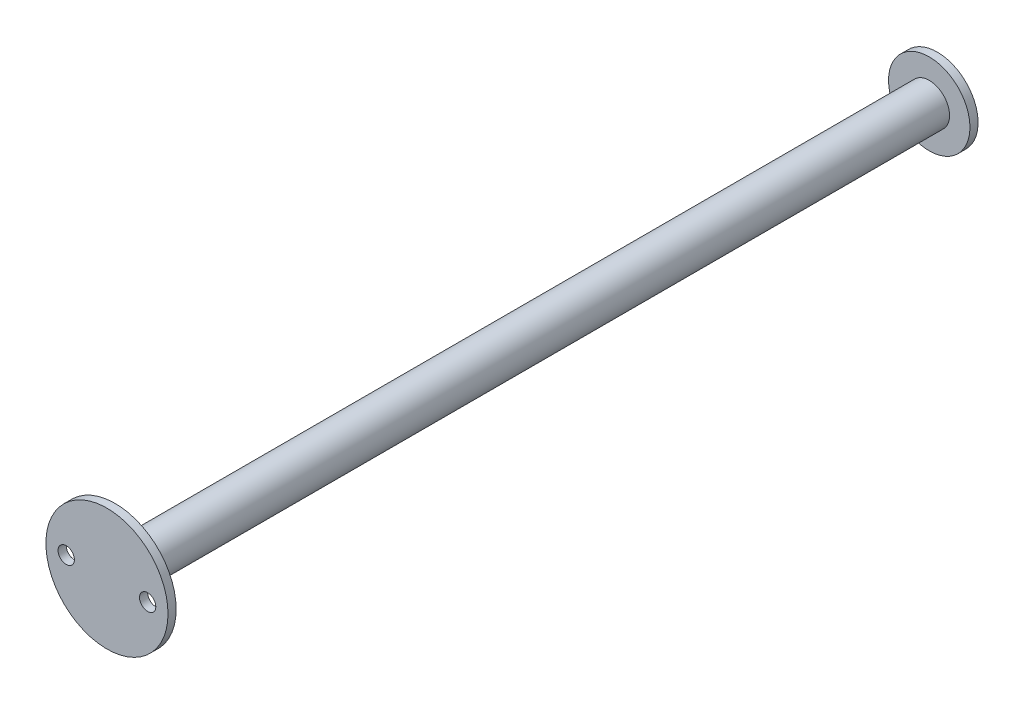
ISO-10303-21;
HEADER;
FILE_DESCRIPTION(('STEP AP214'),'2;1');
FILE_NAME('part.step','',(''),(''),'','','');
FILE_SCHEMA(('AUTOMOTIVE_DESIGN { 1 0 10303 214 1 1 1 1 }'));
ENDSEC;
DATA;
#1=APPLICATION_CONTEXT('core data for automotive mechanical design processes');
#2=APPLICATION_PROTOCOL_DEFINITION('international standard','automotive_design',2000,#1);
#3=PRODUCT_CONTEXT('',#1,'mechanical');
#4=PRODUCT('Part','Part','',(#3));
#5=PRODUCT_RELATED_PRODUCT_CATEGORY('part','',(#4));
#6=PRODUCT_DEFINITION_FORMATION('','',#4);
#7=PRODUCT_DEFINITION_CONTEXT('part definition',#1,'design');
#8=PRODUCT_DEFINITION('design','',#6,#7);
#9=PRODUCT_DEFINITION_SHAPE('','',#8);
#10=(LENGTH_UNIT() NAMED_UNIT(*) SI_UNIT(.MILLI.,.METRE.));
#11=(NAMED_UNIT(*) PLANE_ANGLE_UNIT() SI_UNIT($,.RADIAN.));
#12=(NAMED_UNIT(*) SI_UNIT($,.STERADIAN.) SOLID_ANGLE_UNIT());
#13=UNCERTAINTY_MEASURE_WITH_UNIT(LENGTH_MEASURE(1.E-05),#10,'distance_accuracy_value','');
#14=(GEOMETRIC_REPRESENTATION_CONTEXT(3) GLOBAL_UNCERTAINTY_ASSIGNED_CONTEXT((#13)) GLOBAL_UNIT_ASSIGNED_CONTEXT((#10,
#11,#12)) REPRESENTATION_CONTEXT('',''));
#15=CARTESIAN_POINT('',(0.,0.,0.));
#16=DIRECTION('',(0.,0.,1.));
#17=DIRECTION('',(1.,0.,0.));
#18=AXIS2_PLACEMENT_3D('',#15,#16,#17);
#19=CARTESIAN_POINT('',(0.,0.,100.));
#20=DIRECTION('',(0.,0.,-1.));
#21=DIRECTION('',(-1.,0.,0.));
#22=AXIS2_PLACEMENT_3D('',#19,#20,#21);
#23=CYLINDRICAL_SURFACE('',#22,5.);
#24=CARTESIAN_POINT('',(0.,0.,100.));
#25=DIRECTION('',(0.,0.,1.));
#26=DIRECTION('',(1.,0.,0.));
#27=AXIS2_PLACEMENT_3D('',#24,#25,#26);
#28=CIRCLE('',#27,5.);
#29=CARTESIAN_POINT('',(5.,0.,100.));
#30=VERTEX_POINT('',#29);
#31=EDGE_CURVE('E10',#30,#30,#28,.T.);
#32=ORIENTED_EDGE('',*,*,#31,.F.);
#33=EDGE_LOOP('',(#32));
#34=FACE_BOUND('',#33,.T.);
#35=CARTESIAN_POINT('',(0.,0.,-100.));
#36=DIRECTION('',(0.,0.,1.));
#37=DIRECTION('',(1.,0.,0.));
#38=AXIS2_PLACEMENT_3D('',#35,#36,#37);
#39=CIRCLE('',#38,5.);
#40=CARTESIAN_POINT('',(5.,0.,-100.));
#41=VERTEX_POINT('',#40);
#42=EDGE_CURVE('E33',#41,#41,#39,.T.);
#43=ORIENTED_EDGE('',*,*,#42,.T.);
#44=EDGE_LOOP('',(#43));
#45=FACE_BOUND('',#44,.T.);
#46=ADVANCED_FACE('F30',(#34,#45),#23,.T.);
#47=CARTESIAN_POINT('',(0.,0.,-102.));
#48=DIRECTION('',(0.,0.,1.));
#49=DIRECTION('',(1.,0.,0.));
#50=AXIS2_PLACEMENT_3D('',#47,#48,#49);
#51=CYLINDRICAL_SURFACE('',#50,10.);
#52=CARTESIAN_POINT('',(0.,0.,-102.));
#53=DIRECTION('',(0.,0.,-1.));
#54=DIRECTION('',(-1.,0.,0.));
#55=AXIS2_PLACEMENT_3D('',#52,#53,#54);
#56=CIRCLE('',#55,10.);
#57=CARTESIAN_POINT('',(-10.,0.,-102.));
#58=VERTEX_POINT('',#57);
#59=EDGE_CURVE('E40',#58,#58,#56,.T.);
#60=ORIENTED_EDGE('',*,*,#59,.F.);
#61=EDGE_LOOP('',(#60));
#62=FACE_BOUND('',#61,.T.);
#63=CARTESIAN_POINT('',(0.,0.,-100.));
#64=DIRECTION('',(0.,0.,-1.));
#65=DIRECTION('',(-1.,0.,0.));
#66=AXIS2_PLACEMENT_3D('',#63,#64,#65);
#67=CIRCLE('',#66,10.);
#68=CARTESIAN_POINT('',(-10.,0.,-100.));
#69=VERTEX_POINT('',#68);
#70=EDGE_CURVE('E42',#69,#69,#67,.T.);
#71=ORIENTED_EDGE('',*,*,#70,.T.);
#72=EDGE_LOOP('',(#71));
#73=FACE_BOUND('',#72,.T.);
#74=ADVANCED_FACE('F88',(#62,#73),#51,.T.);
#75=CARTESIAN_POINT('',(0.,0.,-102.));
#76=DIRECTION('',(0.,0.,-1.));
#77=DIRECTION('',(-1.,0.,0.));
#78=AXIS2_PLACEMENT_3D('',#75,#76,#77);
#79=PLANE('',#78);
#80=ORIENTED_EDGE('',*,*,#59,.T.);
#81=EDGE_LOOP('',(#80));
#82=FACE_BOUND('',#81,.T.);
#83=ADVANCED_FACE('F81',(#82),#79,.T.);
#84=CARTESIAN_POINT('',(0.,0.,-100.));
#85=DIRECTION('',(0.,0.,-1.));
#86=DIRECTION('',(-1.,0.,0.));
#87=AXIS2_PLACEMENT_3D('',#84,#85,#86);
#88=PLANE('',#87);
#89=ORIENTED_EDGE('',*,*,#42,.F.);
#90=EDGE_LOOP('',(#89));
#91=FACE_BOUND('',#90,.T.);
#92=ORIENTED_EDGE('',*,*,#70,.F.);
#93=EDGE_LOOP('',(#92));
#94=FACE_BOUND('',#93,.T.);
#95=ADVANCED_FACE('F72',(#91,#94),#88,.F.);
#96=CARTESIAN_POINT('',(0.,0.,102.));
#97=DIRECTION('',(0.,0.,1.));
#98=DIRECTION('',(1.,0.,0.));
#99=AXIS2_PLACEMENT_3D('',#96,#97,#98);
#100=PLANE('',#99);
#101=CARTESIAN_POINT('',(-10.,0.,102.));
#102=DIRECTION('',(0.,0.,1.));
#103=DIRECTION('',(1.,0.,0.));
#104=AXIS2_PLACEMENT_3D('',#101,#102,#103);
#105=CIRCLE('',#104,2.);
#106=CARTESIAN_POINT('',(-8.,0.,102.));
#107=VERTEX_POINT('',#106);
#108=EDGE_CURVE('E51',#107,#107,#105,.T.);
#109=ORIENTED_EDGE('',*,*,#108,.F.);
#110=EDGE_LOOP('',(#109));
#111=FACE_BOUND('',#110,.T.);
#112=CARTESIAN_POINT('',(0.,0.,102.));
#113=DIRECTION('',(0.,0.,1.));
#114=DIRECTION('',(1.,0.,0.));
#115=AXIS2_PLACEMENT_3D('',#112,#113,#114);
#116=CIRCLE('',#115,15.);
#117=CARTESIAN_POINT('',(15.,0.,102.));
#118=VERTEX_POINT('',#117);
#119=EDGE_CURVE('E45',#118,#118,#116,.T.);
#120=ORIENTED_EDGE('',*,*,#119,.T.);
#121=EDGE_LOOP('',(#120));
#122=FACE_BOUND('',#121,.T.);
#123=CARTESIAN_POINT('',(10.,0.,102.));
#124=DIRECTION('',(0.,0.,1.));
#125=DIRECTION('',(-1.,0.,0.));
#126=AXIS2_PLACEMENT_3D('',#123,#124,#125);
#127=CIRCLE('',#126,2.);
#128=CARTESIAN_POINT('',(8.,0.,102.));
#129=VERTEX_POINT('',#128);
#130=EDGE_CURVE('E57',#129,#129,#127,.T.);
#131=ORIENTED_EDGE('',*,*,#130,.F.);
#132=EDGE_LOOP('',(#131));
#133=FACE_BOUND('',#132,.T.);
#134=ADVANCED_FACE('F69',(#111,#122,#133),#100,.T.);
#135=CARTESIAN_POINT('',(0.,0.,100.));
#136=DIRECTION('',(0.,0.,1.));
#137=DIRECTION('',(1.,0.,0.));
#138=AXIS2_PLACEMENT_3D('',#135,#136,#137);
#139=PLANE('',#138);
#140=ORIENTED_EDGE('',*,*,#31,.T.);
#141=EDGE_LOOP('',(#140));
#142=FACE_BOUND('',#141,.T.);
#143=CARTESIAN_POINT('',(0.,0.,100.));
#144=DIRECTION('',(0.,0.,1.));
#145=DIRECTION('',(1.,0.,0.));
#146=AXIS2_PLACEMENT_3D('',#143,#144,#145);
#147=CIRCLE('',#146,15.);
#148=CARTESIAN_POINT('',(15.,0.,100.));
#149=VERTEX_POINT('',#148);
#150=EDGE_CURVE('E48',#149,#149,#147,.T.);
#151=ORIENTED_EDGE('',*,*,#150,.F.);
#152=EDGE_LOOP('',(#151));
#153=FACE_BOUND('',#152,.T.);
#154=CARTESIAN_POINT('',(-10.,0.,100.));
#155=DIRECTION('',(0.,0.,1.));
#156=DIRECTION('',(1.,0.,0.));
#157=AXIS2_PLACEMENT_3D('',#154,#155,#156);
#158=CIRCLE('',#157,2.);
#159=CARTESIAN_POINT('',(-8.,0.,100.));
#160=VERTEX_POINT('',#159);
#161=EDGE_CURVE('E54',#160,#160,#158,.T.);
#162=ORIENTED_EDGE('',*,*,#161,.T.);
#163=EDGE_LOOP('',(#162));
#164=FACE_BOUND('',#163,.T.);
#165=CARTESIAN_POINT('',(10.,0.,100.));
#166=DIRECTION('',(0.,0.,1.));
#167=DIRECTION('',(-1.,0.,0.));
#168=AXIS2_PLACEMENT_3D('',#165,#166,#167);
#169=CIRCLE('',#168,2.);
#170=CARTESIAN_POINT('',(8.,0.,100.));
#171=VERTEX_POINT('',#170);
#172=EDGE_CURVE('E60',#171,#171,#169,.T.);
#173=ORIENTED_EDGE('',*,*,#172,.T.);
#174=EDGE_LOOP('',(#173));
#175=FACE_BOUND('',#174,.T.);
#176=ADVANCED_FACE('F71',(#142,#153,#164,#175),#139,.F.);
#177=CARTESIAN_POINT('',(0.,0.,102.));
#178=DIRECTION('',(0.,0.,-1.));
#179=DIRECTION('',(-1.,0.,0.));
#180=AXIS2_PLACEMENT_3D('',#177,#178,#179);
#181=CYLINDRICAL_SURFACE('',#180,15.);
#182=ORIENTED_EDGE('',*,*,#119,.F.);
#183=EDGE_LOOP('',(#182));
#184=FACE_BOUND('',#183,.T.);
#185=ORIENTED_EDGE('',*,*,#150,.T.);
#186=EDGE_LOOP('',(#185));
#187=FACE_BOUND('',#186,.T.);
#188=ADVANCED_FACE('F79',(#184,#187),#181,.T.);
#189=CARTESIAN_POINT('',(-10.,0.,102.));
#190=DIRECTION('',(0.,0.,-1.));
#191=DIRECTION('',(-1.,0.,0.));
#192=AXIS2_PLACEMENT_3D('',#189,#190,#191);
#193=CYLINDRICAL_SURFACE('',#192,2.);
#194=ORIENTED_EDGE('',*,*,#108,.T.);
#195=EDGE_LOOP('',(#194));
#196=FACE_BOUND('',#195,.T.);
#197=ORIENTED_EDGE('',*,*,#161,.F.);
#198=EDGE_LOOP('',(#197));
#199=FACE_BOUND('',#198,.T.);
#200=ADVANCED_FACE('F107',(#196,#199),#193,.F.);
#201=CARTESIAN_POINT('',(10.,0.,102.));
#202=DIRECTION('',(0.,0.,-1.));
#203=DIRECTION('',(-1.,0.,0.));
#204=AXIS2_PLACEMENT_3D('',#201,#202,#203);
#205=CYLINDRICAL_SURFACE('',#204,2.);
#206=ORIENTED_EDGE('',*,*,#130,.T.);
#207=EDGE_LOOP('',(#206));
#208=FACE_BOUND('',#207,.T.);
#209=ORIENTED_EDGE('',*,*,#172,.F.);
#210=EDGE_LOOP('',(#209));
#211=FACE_BOUND('',#210,.T.);
#212=ADVANCED_FACE('F66',(#208,#211),#205,.F.);
#213=CLOSED_SHELL('',(#46,#74,#83,#95,#134,#176,#188,#200,#212));
#214=MANIFOLD_SOLID_BREP('B2',#213);
#215=ADVANCED_BREP_SHAPE_REPRESENTATION('',(#18,#214),#14);
#216=SHAPE_DEFINITION_REPRESENTATION(#9,#215);
ENDSEC;
END-ISO-10303-21;
